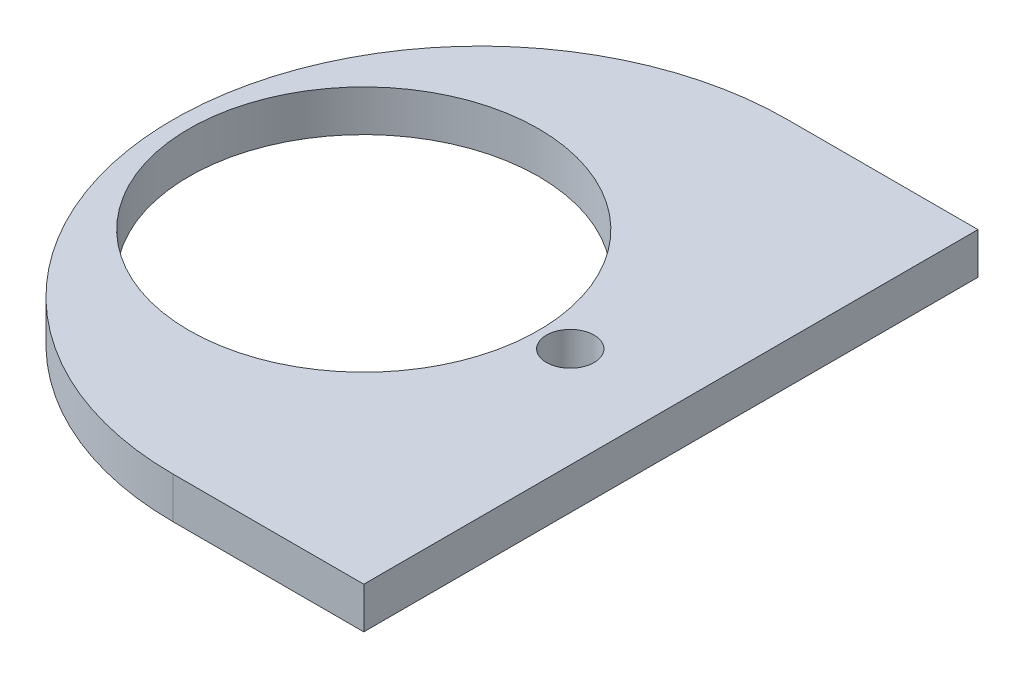
ISO-10303-21;
HEADER;
FILE_DESCRIPTION(('STEP AP214'),'2;1');
FILE_NAME('part.step','',(''),(''),'','','');
FILE_SCHEMA(('AUTOMOTIVE_DESIGN { 1 0 10303 214 1 1 1 1 }'));
ENDSEC;
DATA;
#1=APPLICATION_CONTEXT('core data for automotive mechanical design processes');
#2=APPLICATION_PROTOCOL_DEFINITION('international standard','automotive_design',2000,#1);
#3=PRODUCT_CONTEXT('',#1,'mechanical');
#4=PRODUCT('Part','Part','',(#3));
#5=PRODUCT_RELATED_PRODUCT_CATEGORY('part','',(#4));
#6=PRODUCT_DEFINITION_FORMATION('','',#4);
#7=PRODUCT_DEFINITION_CONTEXT('part definition',#1,'design');
#8=PRODUCT_DEFINITION('design','',#6,#7);
#9=PRODUCT_DEFINITION_SHAPE('','',#8);
#10=(LENGTH_UNIT() NAMED_UNIT(*) SI_UNIT(.MILLI.,.METRE.));
#11=(NAMED_UNIT(*) PLANE_ANGLE_UNIT() SI_UNIT($,.RADIAN.));
#12=(NAMED_UNIT(*) SI_UNIT($,.STERADIAN.) SOLID_ANGLE_UNIT());
#13=UNCERTAINTY_MEASURE_WITH_UNIT(LENGTH_MEASURE(1.E-05),#10,'distance_accuracy_value','');
#14=(GEOMETRIC_REPRESENTATION_CONTEXT(3) GLOBAL_UNCERTAINTY_ASSIGNED_CONTEXT((#13)) GLOBAL_UNIT_ASSIGNED_CONTEXT((#10,
#11,#12)) REPRESENTATION_CONTEXT('',''));
#15=CARTESIAN_POINT('',(0.,0.,0.));
#16=DIRECTION('',(0.,0.,1.));
#17=DIRECTION('',(1.,0.,0.));
#18=AXIS2_PLACEMENT_3D('',#15,#16,#17);
#19=CARTESIAN_POINT('',(0.,7.8,58.));
#20=DIRECTION('',(0.,1.,0.));
#21=DIRECTION('',(0.,0.,1.));
#22=AXIS2_PLACEMENT_3D('',#19,#20,#21);
#23=PLANE('',#22);
#24=CARTESIAN_POINT('',(-22.,7.8,58.));
#25=DIRECTION('',(0.,1.,0.));
#26=DIRECTION('',(0.,0.,1.));
#27=AXIS2_PLACEMENT_3D('',#24,#25,#26);
#28=CIRCLE('',#27,33.);
#29=CARTESIAN_POINT('',(-22.,7.8,91.));
#30=VERTEX_POINT('',#29);
#31=EDGE_CURVE('E118',#30,#30,#28,.T.);
#32=ORIENTED_EDGE('',*,*,#31,.F.);
#33=EDGE_LOOP('',(#32));
#34=FACE_BOUND('',#33,.T.);
#35=CARTESIAN_POINT('',(0.,7.8,58.));
#36=DIRECTION('',(0.,1.,0.));
#37=DIRECTION('',(0.,0.,1.));
#38=AXIS2_PLACEMENT_3D('',#35,#36,#37);
#39=CIRCLE('',#38,58.);
#40=CARTESIAN_POINT('',(0.,7.8,0.));
#41=VERTEX_POINT('',#40);
#42=CARTESIAN_POINT('',(0.,7.8,116.));
#43=VERTEX_POINT('',#42);
#44=EDGE_CURVE('E98',#41,#43,#39,.T.);
#45=ORIENTED_EDGE('',*,*,#44,.T.);
#46=DIRECTION('',(1.,0.,0.));
#47=VECTOR('',#46,1.);
#48=CARTESIAN_POINT('',(36.,7.8,116.));
#49=LINE('',#48,#47);
#50=CARTESIAN_POINT('',(36.,7.8,116.));
#51=VERTEX_POINT('',#50);
#52=EDGE_CURVE('E93',#43,#51,#49,.T.);
#53=ORIENTED_EDGE('',*,*,#52,.T.);
#54=DIRECTION('',(0.,0.,-1.));
#55=VECTOR('',#54,1.);
#56=CARTESIAN_POINT('',(36.,7.8,0.));
#57=LINE('',#56,#55);
#58=CARTESIAN_POINT('',(36.,7.8,0.));
#59=VERTEX_POINT('',#58);
#60=EDGE_CURVE('E96',#51,#59,#57,.T.);
#61=ORIENTED_EDGE('',*,*,#60,.T.);
#62=DIRECTION('',(-1.,0.,0.));
#63=VECTOR('',#62,1.);
#64=CARTESIAN_POINT('',(0.,7.8,0.));
#65=LINE('',#64,#63);
#66=EDGE_CURVE('E63',#59,#41,#65,.T.);
#67=ORIENTED_EDGE('',*,*,#66,.T.);
#68=EDGE_LOOP('',(#45,#53,#61,#67));
#69=FACE_BOUND('',#68,.T.);
#70=CARTESIAN_POINT('',(17.,7.8,58.));
#71=DIRECTION('',(0.,1.,0.));
#72=DIRECTION('',(0.,0.,1.));
#73=AXIS2_PLACEMENT_3D('',#70,#71,#72);
#74=CIRCLE('',#73,4.5);
#75=CARTESIAN_POINT('',(17.,7.8,62.5));
#76=VERTEX_POINT('',#75);
#77=EDGE_CURVE('E140',#76,#76,#74,.T.);
#78=ORIENTED_EDGE('',*,*,#77,.F.);
#79=EDGE_LOOP('',(#78));
#80=FACE_BOUND('',#79,.T.);
#81=ADVANCED_FACE('F45',(#34,#69,#80),#23,.T.);
#82=CARTESIAN_POINT('',(0.,0.,58.));
#83=DIRECTION('',(0.,1.,0.));
#84=DIRECTION('',(0.,0.,1.));
#85=AXIS2_PLACEMENT_3D('',#82,#83,#84);
#86=PLANE('',#85);
#87=CARTESIAN_POINT('',(0.,0.,58.));
#88=DIRECTION('',(0.,1.,0.));
#89=DIRECTION('',(0.,0.,1.));
#90=AXIS2_PLACEMENT_3D('',#87,#88,#89);
#91=CIRCLE('',#90,58.);
#92=CARTESIAN_POINT('',(0.,0.,0.));
#93=VERTEX_POINT('',#92);
#94=CARTESIAN_POINT('',(0.,0.,116.));
#95=VERTEX_POINT('',#94);
#96=EDGE_CURVE('E114',#93,#95,#91,.T.);
#97=ORIENTED_EDGE('',*,*,#96,.F.);
#98=DIRECTION('',(-1.,0.,0.));
#99=VECTOR('',#98,1.);
#100=CARTESIAN_POINT('',(0.,0.,0.));
#101=LINE('',#100,#99);
#102=CARTESIAN_POINT('',(36.,0.,0.));
#103=VERTEX_POINT('',#102);
#104=EDGE_CURVE('E86',#103,#93,#101,.T.);
#105=ORIENTED_EDGE('',*,*,#104,.F.);
#106=DIRECTION('',(0.,0.,-1.));
#107=VECTOR('',#106,1.);
#108=CARTESIAN_POINT('',(36.,0.,0.));
#109=LINE('',#108,#107);
#110=CARTESIAN_POINT('',(36.,0.,116.));
#111=VERTEX_POINT('',#110);
#112=EDGE_CURVE('E80',#111,#103,#109,.T.);
#113=ORIENTED_EDGE('',*,*,#112,.F.);
#114=DIRECTION('',(1.,0.,0.));
#115=VECTOR('',#114,1.);
#116=CARTESIAN_POINT('',(36.,0.,116.));
#117=LINE('',#116,#115);
#118=EDGE_CURVE('E103',#95,#111,#117,.T.);
#119=ORIENTED_EDGE('',*,*,#118,.F.);
#120=EDGE_LOOP('',(#97,#105,#113,#119));
#121=FACE_BOUND('',#120,.T.);
#122=CARTESIAN_POINT('',(-22.,0.,58.));
#123=DIRECTION('',(0.,1.,0.));
#124=DIRECTION('',(0.,0.,1.));
#125=AXIS2_PLACEMENT_3D('',#122,#123,#124);
#126=CIRCLE('',#125,33.);
#127=CARTESIAN_POINT('',(-22.,0.,91.));
#128=VERTEX_POINT('',#127);
#129=EDGE_CURVE('E136',#128,#128,#126,.T.);
#130=ORIENTED_EDGE('',*,*,#129,.T.);
#131=EDGE_LOOP('',(#130));
#132=FACE_BOUND('',#131,.T.);
#133=CARTESIAN_POINT('',(17.,0.,58.));
#134=DIRECTION('',(0.,1.,0.));
#135=DIRECTION('',(0.,0.,1.));
#136=AXIS2_PLACEMENT_3D('',#133,#134,#135);
#137=CIRCLE('',#136,4.5);
#138=CARTESIAN_POINT('',(17.,0.,62.5));
#139=VERTEX_POINT('',#138);
#140=EDGE_CURVE('E144',#139,#139,#137,.T.);
#141=ORIENTED_EDGE('',*,*,#140,.T.);
#142=EDGE_LOOP('',(#141));
#143=FACE_BOUND('',#142,.T.);
#144=ADVANCED_FACE('F131',(#121,#132,#143),#86,.F.);
#145=CARTESIAN_POINT('',(0.,7.8,58.));
#146=DIRECTION('',(0.,-1.,0.));
#147=DIRECTION('',(0.,0.,-1.));
#148=AXIS2_PLACEMENT_3D('',#145,#146,#147);
#149=CYLINDRICAL_SURFACE('',#148,58.);
#150=ORIENTED_EDGE('',*,*,#96,.T.);
#151=DIRECTION('',(0.,-1.,0.));
#152=VECTOR('',#151,1.);
#153=CARTESIAN_POINT('',(0.,7.8,116.));
#154=LINE('',#153,#152);
#155=EDGE_CURVE('E11',#43,#95,#154,.T.);
#156=ORIENTED_EDGE('',*,*,#155,.F.);
#157=ORIENTED_EDGE('',*,*,#44,.F.);
#158=DIRECTION('',(0.,-1.,0.));
#159=VECTOR('',#158,1.);
#160=CARTESIAN_POINT('',(0.,7.8,0.));
#161=LINE('',#160,#159);
#162=EDGE_CURVE('E110',#41,#93,#161,.T.);
#163=ORIENTED_EDGE('',*,*,#162,.T.);
#164=EDGE_LOOP('',(#150,#156,#157,#163));
#165=FACE_BOUND('',#164,.T.);
#166=ADVANCED_FACE('F47',(#165),#149,.T.);
#167=CARTESIAN_POINT('',(36.,7.8,116.));
#168=DIRECTION('',(0.,0.,-1.));
#169=DIRECTION('',(-1.,0.,0.));
#170=AXIS2_PLACEMENT_3D('',#167,#168,#169);
#171=PLANE('',#170);
#172=ORIENTED_EDGE('',*,*,#118,.T.);
#173=DIRECTION('',(0.,-1.,0.));
#174=VECTOR('',#173,1.);
#175=CARTESIAN_POINT('',(36.,7.8,116.));
#176=LINE('',#175,#174);
#177=EDGE_CURVE('E55',#51,#111,#176,.T.);
#178=ORIENTED_EDGE('',*,*,#177,.F.);
#179=ORIENTED_EDGE('',*,*,#52,.F.);
#180=ORIENTED_EDGE('',*,*,#155,.T.);
#181=EDGE_LOOP('',(#172,#178,#179,#180));
#182=FACE_BOUND('',#181,.T.);
#183=ADVANCED_FACE('F102',(#182),#171,.F.);
#184=CARTESIAN_POINT('',(36.,7.8,0.));
#185=DIRECTION('',(-1.,0.,0.));
#186=DIRECTION('',(0.,0.,1.));
#187=AXIS2_PLACEMENT_3D('',#184,#185,#186);
#188=PLANE('',#187);
#189=ORIENTED_EDGE('',*,*,#112,.T.);
#190=DIRECTION('',(0.,-1.,0.));
#191=VECTOR('',#190,1.);
#192=CARTESIAN_POINT('',(36.,7.8,0.));
#193=LINE('',#192,#191);
#194=EDGE_CURVE('E105',#59,#103,#193,.T.);
#195=ORIENTED_EDGE('',*,*,#194,.F.);
#196=ORIENTED_EDGE('',*,*,#60,.F.);
#197=ORIENTED_EDGE('',*,*,#177,.T.);
#198=EDGE_LOOP('',(#189,#195,#196,#197));
#199=FACE_BOUND('',#198,.T.);
#200=ADVANCED_FACE('F106',(#199),#188,.F.);
#201=CARTESIAN_POINT('',(0.,7.8,0.));
#202=DIRECTION('',(0.,0.,1.));
#203=DIRECTION('',(1.,0.,0.));
#204=AXIS2_PLACEMENT_3D('',#201,#202,#203);
#205=PLANE('',#204);
#206=ORIENTED_EDGE('',*,*,#104,.T.);
#207=ORIENTED_EDGE('',*,*,#162,.F.);
#208=ORIENTED_EDGE('',*,*,#66,.F.);
#209=ORIENTED_EDGE('',*,*,#194,.T.);
#210=EDGE_LOOP('',(#206,#207,#208,#209));
#211=FACE_BOUND('',#210,.T.);
#212=ADVANCED_FACE('F128',(#211),#205,.F.);
#213=CARTESIAN_POINT('',(-22.,7.8,58.));
#214=DIRECTION('',(0.,-1.,0.));
#215=DIRECTION('',(0.,0.,-1.));
#216=AXIS2_PLACEMENT_3D('',#213,#214,#215);
#217=CYLINDRICAL_SURFACE('',#216,33.);
#218=ORIENTED_EDGE('',*,*,#31,.T.);
#219=EDGE_LOOP('',(#218));
#220=FACE_BOUND('',#219,.T.);
#221=ORIENTED_EDGE('',*,*,#129,.F.);
#222=EDGE_LOOP('',(#221));
#223=FACE_BOUND('',#222,.T.);
#224=ADVANCED_FACE('F163',(#220,#223),#217,.F.);
#225=CARTESIAN_POINT('',(17.,7.8,58.));
#226=DIRECTION('',(0.,-1.,0.));
#227=DIRECTION('',(0.,0.,-1.));
#228=AXIS2_PLACEMENT_3D('',#225,#226,#227);
#229=CYLINDRICAL_SURFACE('',#228,4.5);
#230=ORIENTED_EDGE('',*,*,#77,.T.);
#231=EDGE_LOOP('',(#230));
#232=FACE_BOUND('',#231,.T.);
#233=ORIENTED_EDGE('',*,*,#140,.F.);
#234=EDGE_LOOP('',(#233));
#235=FACE_BOUND('',#234,.T.);
#236=ADVANCED_FACE('F152',(#232,#235),#229,.F.);
#237=CLOSED_SHELL('',(#81,#144,#166,#183,#200,#212,#224,#236));
#238=MANIFOLD_SOLID_BREP('B2',#237);
#239=ADVANCED_BREP_SHAPE_REPRESENTATION('',(#18,#238),#14);
#240=SHAPE_DEFINITION_REPRESENTATION(#9,#239);
ENDSEC;
END-ISO-10303-21;
